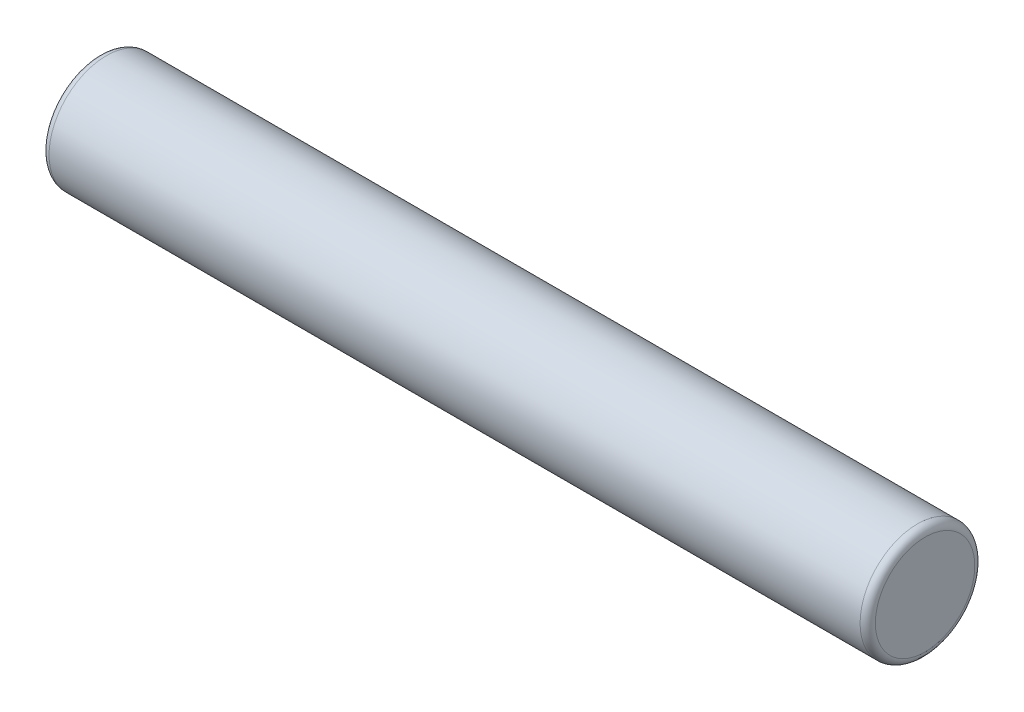
ISO-10303-21;
HEADER;
FILE_DESCRIPTION(('STEP AP214'),'2;1');
FILE_NAME('part.step','',(''),(''),'','','');
FILE_SCHEMA(('AUTOMOTIVE_DESIGN { 1 0 10303 214 1 1 1 1 }'));
ENDSEC;
DATA;
#1=APPLICATION_CONTEXT('core data for automotive mechanical design processes');
#2=APPLICATION_PROTOCOL_DEFINITION('international standard','automotive_design',2000,#1);
#3=PRODUCT_CONTEXT('',#1,'mechanical');
#4=PRODUCT('Part','Part','',(#3));
#5=PRODUCT_RELATED_PRODUCT_CATEGORY('part','',(#4));
#6=PRODUCT_DEFINITION_FORMATION('','',#4);
#7=PRODUCT_DEFINITION_CONTEXT('part definition',#1,'design');
#8=PRODUCT_DEFINITION('design','',#6,#7);
#9=PRODUCT_DEFINITION_SHAPE('','',#8);
#10=(LENGTH_UNIT() NAMED_UNIT(*) SI_UNIT(.MILLI.,.METRE.));
#11=(NAMED_UNIT(*) PLANE_ANGLE_UNIT() SI_UNIT($,.RADIAN.));
#12=(NAMED_UNIT(*) SI_UNIT($,.STERADIAN.) SOLID_ANGLE_UNIT());
#13=UNCERTAINTY_MEASURE_WITH_UNIT(LENGTH_MEASURE(1.E-05),#10,'distance_accuracy_value','');
#14=(GEOMETRIC_REPRESENTATION_CONTEXT(3) GLOBAL_UNCERTAINTY_ASSIGNED_CONTEXT((#13)) GLOBAL_UNIT_ASSIGNED_CONTEXT((#10,
#11,#12)) REPRESENTATION_CONTEXT('',''));
#15=CARTESIAN_POINT('',(0.,0.,0.));
#16=DIRECTION('',(0.,0.,1.));
#17=DIRECTION('',(1.,0.,0.));
#18=AXIS2_PLACEMENT_3D('',#15,#16,#17);
#19=CARTESIAN_POINT('',(2.6,5.09153952687566,0.650000018489742));
#20=DIRECTION('',(-1.,0.,0.));
#21=DIRECTION('',(0.,1.,0.));
#22=AXIS2_PLACEMENT_3D('',#19,#20,#21);
#23=PLANE('',#22);
#24=CARTESIAN_POINT('',(2.6,5.75,0.));
#25=DIRECTION('',(-1.,0.,0.));
#26=DIRECTION('',(0.,0.,-1.));
#27=AXIS2_PLACEMENT_3D('',#24,#25,#26);
#28=CIRCLE('',#27,0.650000012105917);
#29=CARTESIAN_POINT('',(2.6,5.75,-0.650000012105917));
#30=VERTEX_POINT('',#29);
#31=EDGE_CURVE('E30',#30,#30,#28,.F.);
#32=ORIENTED_EDGE('',*,*,#31,.F.);
#33=EDGE_LOOP('',(#32));
#34=FACE_BOUND('',#33,.T.);
#35=ADVANCED_FACE('F15',(#34),#23,.T.);
#36=CARTESIAN_POINT('',(13.4,5.09153957545546,-0.65));
#37=DIRECTION('',(1.,0.,0.));
#38=DIRECTION('',(0.,1.,0.));
#39=AXIS2_PLACEMENT_3D('',#36,#37,#38);
#40=PLANE('',#39);
#41=CARTESIAN_POINT('',(13.4,5.75,0.));
#42=DIRECTION('',(1.,0.,0.));
#43=DIRECTION('',(0.,-1.41925000299091E-07,0.99999999999999));
#44=AXIS2_PLACEMENT_3D('',#41,#42,#43);
#45=CIRCLE('',#44,0.649999999999994);
#46=CARTESIAN_POINT('',(13.4,5.74999990774875,0.649999999999987));
#47=VERTEX_POINT('',#46);
#48=EDGE_CURVE('E26',#47,#47,#45,.T.);
#49=ORIENTED_EDGE('',*,*,#48,.T.);
#50=EDGE_LOOP('',(#49));
#51=FACE_BOUND('',#50,.T.);
#52=ADVANCED_FACE('F40',(#51),#40,.T.);
#53=CARTESIAN_POINT('',(2.69999999999984,5.75,0.));
#54=DIRECTION('',(1.,0.,0.));
#55=DIRECTION('',(0.,1.42067182585033E-07,0.99999999999999));
#56=AXIS2_PLACEMENT_3D('',#53,#54,#55);
#57=TOROIDAL_SURFACE('',#56,0.650000000000156,0.0999999999998454);
#58=ORIENTED_EDGE('',*,*,#31,.T.);
#59=EDGE_LOOP('',(#58));
#60=FACE_BOUND('',#59,.T.);
#61=CARTESIAN_POINT('',(2.69999999999984,5.75,0.));
#62=DIRECTION('',(-1.,0.,0.));
#63=DIRECTION('',(0.,0.,-1.));
#64=AXIS2_PLACEMENT_3D('',#61,#62,#63);
#65=CIRCLE('',#64,0.750000000000001);
#66=CARTESIAN_POINT('',(2.69999999999984,5.75,-0.750000000000001));
#67=VERTEX_POINT('',#66);
#68=EDGE_CURVE('E22',#67,#67,#65,.F.);
#69=ORIENTED_EDGE('',*,*,#68,.F.);
#70=EDGE_LOOP('',(#69));
#71=FACE_BOUND('',#70,.T.);
#72=ADVANCED_FACE('F36',(#60,#71),#57,.T.);
#73=CARTESIAN_POINT('',(13.4,5.75,0.));
#74=DIRECTION('',(1.,0.,0.));
#75=DIRECTION('',(0.,1.92332050626273E-10,1.));
#76=AXIS2_PLACEMENT_3D('',#73,#74,#75);
#77=CYLINDRICAL_SURFACE('',#76,0.75);
#78=CARTESIAN_POINT('',(13.3,5.75,0.));
#79=DIRECTION('',(-1.,0.,0.));
#80=DIRECTION('',(0.,0.,-1.));
#81=AXIS2_PLACEMENT_3D('',#78,#79,#80);
#82=CIRCLE('',#81,0.75);
#83=CARTESIAN_POINT('',(13.3,5.75,-0.75));
#84=VERTEX_POINT('',#83);
#85=EDGE_CURVE('E10',#84,#84,#82,.F.);
#86=ORIENTED_EDGE('',*,*,#85,.F.);
#87=EDGE_LOOP('',(#86));
#88=FACE_BOUND('',#87,.T.);
#89=ORIENTED_EDGE('',*,*,#68,.T.);
#90=EDGE_LOOP('',(#89));
#91=FACE_BOUND('',#90,.T.);
#92=ADVANCED_FACE('F50',(#88,#91),#77,.T.);
#93=CARTESIAN_POINT('',(13.3000000000007,5.75,0.));
#94=DIRECTION('',(1.,0.,0.));
#95=DIRECTION('',(0.,1.92332050626273E-10,1.));
#96=AXIS2_PLACEMENT_3D('',#93,#94,#95);
#97=TOROIDAL_SURFACE('',#96,0.650000000000664,0.0999999999993367);
#98=ORIENTED_EDGE('',*,*,#85,.T.);
#99=EDGE_LOOP('',(#98));
#100=FACE_BOUND('',#99,.T.);
#101=ORIENTED_EDGE('',*,*,#48,.F.);
#102=EDGE_LOOP('',(#101));
#103=FACE_BOUND('',#102,.T.);
#104=ADVANCED_FACE('F17',(#100,#103),#97,.T.);
#105=CLOSED_SHELL('',(#35,#52,#72,#92,#104));
#106=MANIFOLD_SOLID_BREP('B1',#105);
#107=ADVANCED_BREP_SHAPE_REPRESENTATION('',(#18,#106),#14);
#108=SHAPE_DEFINITION_REPRESENTATION(#9,#107);
ENDSEC;
END-ISO-10303-21;
